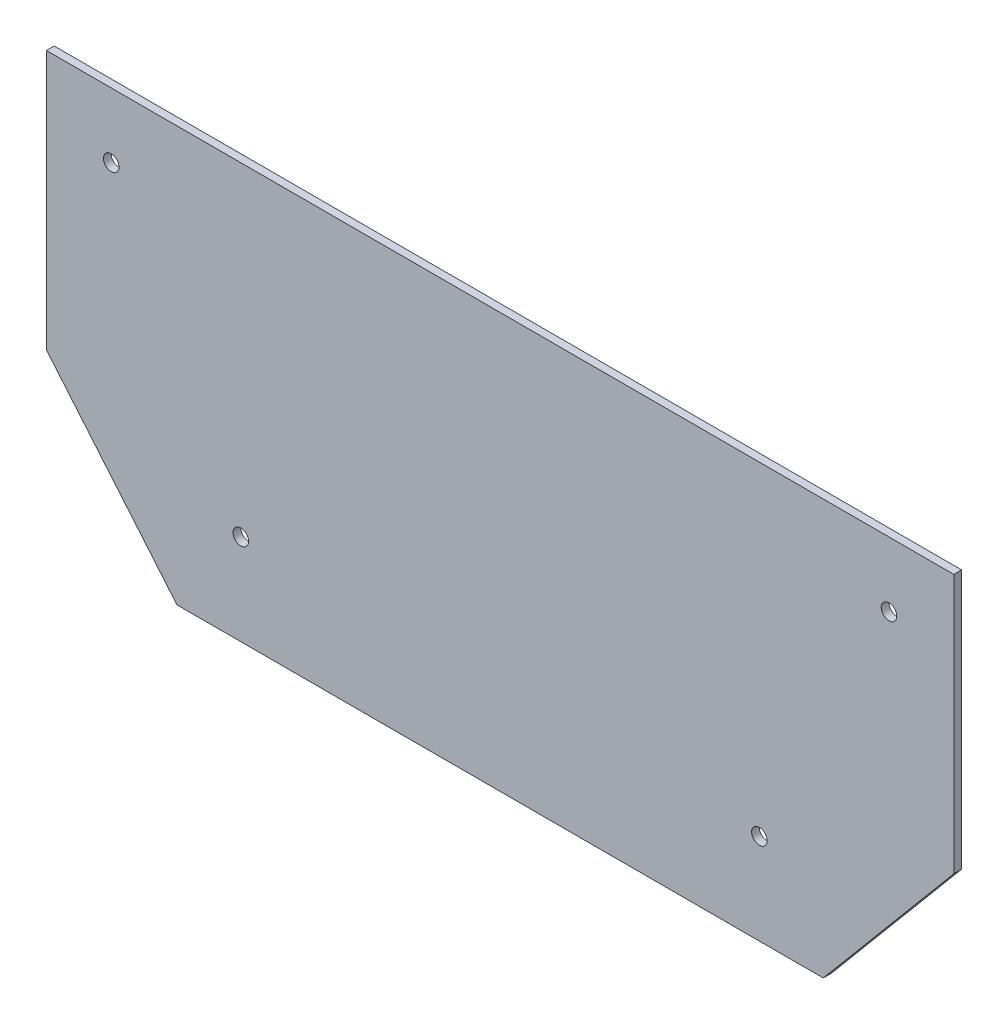
ISO-10303-21;
HEADER;
FILE_DESCRIPTION(('STEP AP214'),'2;1');
FILE_NAME('part.step','',(''),(''),'','','');
FILE_SCHEMA(('AUTOMOTIVE_DESIGN { 1 0 10303 214 1 1 1 1 }'));
ENDSEC;
DATA;
#1=APPLICATION_CONTEXT('core data for automotive mechanical design processes');
#2=APPLICATION_PROTOCOL_DEFINITION('international standard','automotive_design',2000,#1);
#3=PRODUCT_CONTEXT('',#1,'mechanical');
#4=PRODUCT('Part','Part','',(#3));
#5=PRODUCT_RELATED_PRODUCT_CATEGORY('part','',(#4));
#6=PRODUCT_DEFINITION_FORMATION('','',#4);
#7=PRODUCT_DEFINITION_CONTEXT('part definition',#1,'design');
#8=PRODUCT_DEFINITION('design','',#6,#7);
#9=PRODUCT_DEFINITION_SHAPE('','',#8);
#10=(LENGTH_UNIT() NAMED_UNIT(*) SI_UNIT(.MILLI.,.METRE.));
#11=(NAMED_UNIT(*) PLANE_ANGLE_UNIT() SI_UNIT($,.RADIAN.));
#12=(NAMED_UNIT(*) SI_UNIT($,.STERADIAN.) SOLID_ANGLE_UNIT());
#13=UNCERTAINTY_MEASURE_WITH_UNIT(LENGTH_MEASURE(1.E-05),#10,'distance_accuracy_value','');
#14=(GEOMETRIC_REPRESENTATION_CONTEXT(3) GLOBAL_UNCERTAINTY_ASSIGNED_CONTEXT((#13)) GLOBAL_UNIT_ASSIGNED_CONTEXT((#10,
#11,#12)) REPRESENTATION_CONTEXT('',''));
#15=CARTESIAN_POINT('',(0.,0.,0.));
#16=DIRECTION('',(0.,0.,1.));
#17=DIRECTION('',(1.,0.,0.));
#18=AXIS2_PLACEMENT_3D('',#15,#16,#17);
#19=CARTESIAN_POINT('',(0.,0.,1.5));
#20=DIRECTION('',(0.,0.,-1.));
#21=DIRECTION('',(-1.,0.,0.));
#22=AXIS2_PLACEMENT_3D('',#19,#20,#21);
#23=PLANE('',#22);
#24=DIRECTION('',(0.,-1.,0.));
#25=VECTOR('',#24,1.);
#26=CARTESIAN_POINT('',(-87.5,-10.,1.5));
#27=LINE('',#26,#25);
#28=CARTESIAN_POINT('',(-87.5,40.,1.5));
#29=VERTEX_POINT('',#28);
#30=CARTESIAN_POINT('',(-87.5,-10.,1.5));
#31=VERTEX_POINT('',#30);
#32=EDGE_CURVE('E129',#29,#31,#27,.T.);
#33=ORIENTED_EDGE('',*,*,#32,.T.);
#34=DIRECTION('',(0.642787609686538,-0.766044443118979,0.));
#35=VECTOR('',#34,1.);
#36=CARTESIAN_POINT('',(-62.3270110646817,-40.,1.5));
#37=LINE('',#36,#35);
#38=CARTESIAN_POINT('',(-62.3270110646817,-40.,1.5));
#39=VERTEX_POINT('',#38);
#40=EDGE_CURVE('E87',#31,#39,#37,.T.);
#41=ORIENTED_EDGE('',*,*,#40,.T.);
#42=DIRECTION('',(1.,0.,0.));
#43=VECTOR('',#42,1.);
#44=CARTESIAN_POINT('',(62.3270110646817,-40.,1.5));
#45=LINE('',#44,#43);
#46=CARTESIAN_POINT('',(62.3270110646817,-40.,1.5));
#47=VERTEX_POINT('',#46);
#48=EDGE_CURVE('E100',#39,#47,#45,.T.);
#49=ORIENTED_EDGE('',*,*,#48,.T.);
#50=DIRECTION('',(0.642787609686537,0.76604444311898,0.));
#51=VECTOR('',#50,1.);
#52=CARTESIAN_POINT('',(87.5,-9.99999999999995,1.5));
#53=LINE('',#52,#51);
#54=CARTESIAN_POINT('',(87.5,-9.99999999999995,1.5));
#55=VERTEX_POINT('',#54);
#56=EDGE_CURVE('E94',#47,#55,#53,.T.);
#57=ORIENTED_EDGE('',*,*,#56,.T.);
#58=DIRECTION('',(0.,1.,0.));
#59=VECTOR('',#58,1.);
#60=CARTESIAN_POINT('',(87.5,40.,1.5));
#61=LINE('',#60,#59);
#62=CARTESIAN_POINT('',(87.5,40.,1.5));
#63=VERTEX_POINT('',#62);
#64=EDGE_CURVE('E98',#55,#63,#61,.T.);
#65=ORIENTED_EDGE('',*,*,#64,.T.);
#66=DIRECTION('',(-1.,0.,0.));
#67=VECTOR('',#66,1.);
#68=CARTESIAN_POINT('',(-87.5,40.,1.5));
#69=LINE('',#68,#67);
#70=EDGE_CURVE('E50',#63,#29,#69,.T.);
#71=ORIENTED_EDGE('',*,*,#70,.T.);
#72=EDGE_LOOP('',(#33,#41,#49,#57,#65,#71));
#73=FACE_BOUND('',#72,.T.);
#74=CARTESIAN_POINT('',(-75.,27.5,1.5));
#75=DIRECTION('',(0.,0.,1.));
#76=DIRECTION('',(1.,0.,0.));
#77=AXIS2_PLACEMENT_3D('',#74,#75,#76);
#78=CIRCLE('',#77,1.5);
#79=CARTESIAN_POINT('',(-73.5,27.5,1.5));
#80=VERTEX_POINT('',#79);
#81=EDGE_CURVE('E122',#80,#80,#78,.T.);
#82=ORIENTED_EDGE('',*,*,#81,.F.);
#83=EDGE_LOOP('',(#82));
#84=FACE_BOUND('',#83,.T.);
#85=CARTESIAN_POINT('',(-50.,-22.5,1.5));
#86=DIRECTION('',(0.,0.,1.));
#87=DIRECTION('',(1.,0.,0.));
#88=AXIS2_PLACEMENT_3D('',#85,#86,#87);
#89=CIRCLE('',#88,1.5);
#90=CARTESIAN_POINT('',(-48.5,-22.5,1.5));
#91=VERTEX_POINT('',#90);
#92=EDGE_CURVE('E193',#91,#91,#89,.T.);
#93=ORIENTED_EDGE('',*,*,#92,.F.);
#94=EDGE_LOOP('',(#93));
#95=FACE_BOUND('',#94,.T.);
#96=CARTESIAN_POINT('',(50.,-22.5,1.5));
#97=DIRECTION('',(0.,0.,1.));
#98=DIRECTION('',(1.,0.,0.));
#99=AXIS2_PLACEMENT_3D('',#96,#97,#98);
#100=CIRCLE('',#99,1.5);
#101=CARTESIAN_POINT('',(51.5,-22.5,1.5));
#102=VERTEX_POINT('',#101);
#103=EDGE_CURVE('E187',#102,#102,#100,.T.);
#104=ORIENTED_EDGE('',*,*,#103,.F.);
#105=EDGE_LOOP('',(#104));
#106=FACE_BOUND('',#105,.T.);
#107=CARTESIAN_POINT('',(75.,27.5,1.5));
#108=DIRECTION('',(0.,0.,1.));
#109=DIRECTION('',(1.,0.,0.));
#110=AXIS2_PLACEMENT_3D('',#107,#108,#109);
#111=CIRCLE('',#110,1.5);
#112=CARTESIAN_POINT('',(76.5,27.5,1.5));
#113=VERTEX_POINT('',#112);
#114=EDGE_CURVE('E178',#113,#113,#111,.T.);
#115=ORIENTED_EDGE('',*,*,#114,.F.);
#116=EDGE_LOOP('',(#115));
#117=FACE_BOUND('',#116,.T.);
#118=ADVANCED_FACE('F33',(#73,#84,#95,#106,#117),#23,.F.);
#119=CARTESIAN_POINT('',(0.,0.,0.));
#120=DIRECTION('',(0.,0.,-1.));
#121=DIRECTION('',(-1.,0.,0.));
#122=AXIS2_PLACEMENT_3D('',#119,#120,#121);
#123=PLANE('',#122);
#124=CARTESIAN_POINT('',(50.,-22.5,0.));
#125=DIRECTION('',(0.,0.,1.));
#126=DIRECTION('',(1.,0.,0.));
#127=AXIS2_PLACEMENT_3D('',#124,#125,#126);
#128=CIRCLE('',#127,1.5);
#129=CARTESIAN_POINT('',(51.5,-22.5,0.));
#130=VERTEX_POINT('',#129);
#131=EDGE_CURVE('E184',#130,#130,#128,.T.);
#132=ORIENTED_EDGE('',*,*,#131,.T.);
#133=EDGE_LOOP('',(#132));
#134=FACE_BOUND('',#133,.T.);
#135=CARTESIAN_POINT('',(-75.,27.5,0.));
#136=DIRECTION('',(0.,0.,1.));
#137=DIRECTION('',(1.,0.,0.));
#138=AXIS2_PLACEMENT_3D('',#135,#136,#137);
#139=CIRCLE('',#138,1.5);
#140=CARTESIAN_POINT('',(-73.5,27.5,0.));
#141=VERTEX_POINT('',#140);
#142=EDGE_CURVE('E196',#141,#141,#139,.T.);
#143=ORIENTED_EDGE('',*,*,#142,.T.);
#144=EDGE_LOOP('',(#143));
#145=FACE_BOUND('',#144,.T.);
#146=DIRECTION('',(0.,-1.,0.));
#147=VECTOR('',#146,1.);
#148=CARTESIAN_POINT('',(-87.5,-10.,0.));
#149=LINE('',#148,#147);
#150=CARTESIAN_POINT('',(-87.5,40.,0.));
#151=VERTEX_POINT('',#150);
#152=CARTESIAN_POINT('',(-87.5,-10.,0.));
#153=VERTEX_POINT('',#152);
#154=EDGE_CURVE('E118',#151,#153,#149,.T.);
#155=ORIENTED_EDGE('',*,*,#154,.F.);
#156=DIRECTION('',(-1.,0.,0.));
#157=VECTOR('',#156,1.);
#158=CARTESIAN_POINT('',(-87.5,40.,0.));
#159=LINE('',#158,#157);
#160=CARTESIAN_POINT('',(87.5,40.,0.));
#161=VERTEX_POINT('',#160);
#162=EDGE_CURVE('E79',#161,#151,#159,.T.);
#163=ORIENTED_EDGE('',*,*,#162,.F.);
#164=DIRECTION('',(0.,1.,0.));
#165=VECTOR('',#164,1.);
#166=CARTESIAN_POINT('',(87.5,40.,0.));
#167=LINE('',#166,#165);
#168=CARTESIAN_POINT('',(87.5,-9.99999999999995,0.));
#169=VERTEX_POINT('',#168);
#170=EDGE_CURVE('E73',#169,#161,#167,.T.);
#171=ORIENTED_EDGE('',*,*,#170,.F.);
#172=DIRECTION('',(0.642787609686537,0.76604444311898,0.));
#173=VECTOR('',#172,1.);
#174=CARTESIAN_POINT('',(87.5,-9.99999999999995,0.));
#175=LINE('',#174,#173);
#176=CARTESIAN_POINT('',(62.3270110646817,-40.,0.));
#177=VERTEX_POINT('',#176);
#178=EDGE_CURVE('E108',#177,#169,#175,.T.);
#179=ORIENTED_EDGE('',*,*,#178,.F.);
#180=DIRECTION('',(1.,0.,0.));
#181=VECTOR('',#180,1.);
#182=CARTESIAN_POINT('',(62.3270110646817,-40.,0.));
#183=LINE('',#182,#181);
#184=CARTESIAN_POINT('',(-62.3270110646817,-40.,0.));
#185=VERTEX_POINT('',#184);
#186=EDGE_CURVE('E124',#185,#177,#183,.T.);
#187=ORIENTED_EDGE('',*,*,#186,.F.);
#188=DIRECTION('',(0.642787609686538,-0.766044443118979,0.));
#189=VECTOR('',#188,1.);
#190=CARTESIAN_POINT('',(-62.3270110646817,-40.,0.));
#191=LINE('',#190,#189);
#192=EDGE_CURVE('E121',#153,#185,#191,.T.);
#193=ORIENTED_EDGE('',*,*,#192,.F.);
#194=EDGE_LOOP('',(#155,#163,#171,#179,#187,#193));
#195=FACE_BOUND('',#194,.T.);
#196=CARTESIAN_POINT('',(-50.,-22.5,0.));
#197=DIRECTION('',(0.,0.,1.));
#198=DIRECTION('',(1.,0.,0.));
#199=AXIS2_PLACEMENT_3D('',#196,#197,#198);
#200=CIRCLE('',#199,1.5);
#201=CARTESIAN_POINT('',(-48.5,-22.5,0.));
#202=VERTEX_POINT('',#201);
#203=EDGE_CURVE('E190',#202,#202,#200,.T.);
#204=ORIENTED_EDGE('',*,*,#203,.T.);
#205=EDGE_LOOP('',(#204));
#206=FACE_BOUND('',#205,.T.);
#207=CARTESIAN_POINT('',(75.,27.5,0.));
#208=DIRECTION('',(0.,0.,1.));
#209=DIRECTION('',(1.,0.,0.));
#210=AXIS2_PLACEMENT_3D('',#207,#208,#209);
#211=CIRCLE('',#210,1.5);
#212=CARTESIAN_POINT('',(76.5,27.5,0.));
#213=VERTEX_POINT('',#212);
#214=EDGE_CURVE('E181',#213,#213,#211,.T.);
#215=ORIENTED_EDGE('',*,*,#214,.T.);
#216=EDGE_LOOP('',(#215));
#217=FACE_BOUND('',#216,.T.);
#218=ADVANCED_FACE('F138',(#134,#145,#195,#206,#217),#123,.T.);
#219=CARTESIAN_POINT('',(-87.5,-10.,1.5));
#220=DIRECTION('',(1.,0.,0.));
#221=DIRECTION('',(0.,0.,-1.));
#222=AXIS2_PLACEMENT_3D('',#219,#220,#221);
#223=PLANE('',#222);
#224=ORIENTED_EDGE('',*,*,#154,.T.);
#225=DIRECTION('',(0.,0.,-1.));
#226=VECTOR('',#225,1.);
#227=CARTESIAN_POINT('',(-87.5,-10.,1.5));
#228=LINE('',#227,#226);
#229=EDGE_CURVE('E11',#31,#153,#228,.T.);
#230=ORIENTED_EDGE('',*,*,#229,.F.);
#231=ORIENTED_EDGE('',*,*,#32,.F.);
#232=DIRECTION('',(0.,0.,-1.));
#233=VECTOR('',#232,1.);
#234=CARTESIAN_POINT('',(-87.5,40.,1.5));
#235=LINE('',#234,#233);
#236=EDGE_CURVE('E114',#29,#151,#235,.T.);
#237=ORIENTED_EDGE('',*,*,#236,.T.);
#238=EDGE_LOOP('',(#224,#230,#231,#237));
#239=FACE_BOUND('',#238,.T.);
#240=ADVANCED_FACE('F35',(#239),#223,.F.);
#241=CARTESIAN_POINT('',(-62.3270110646817,-40.,1.5));
#242=DIRECTION('',(0.766044443118979,0.642787609686538,0.));
#243=DIRECTION('',(-0.642787609686538,0.766044443118979,0.));
#244=AXIS2_PLACEMENT_3D('',#241,#242,#243);
#245=PLANE('',#244);
#246=ORIENTED_EDGE('',*,*,#192,.T.);
#247=DIRECTION('',(0.,0.,-1.));
#248=VECTOR('',#247,1.);
#249=CARTESIAN_POINT('',(-62.3270110646817,-40.,1.5));
#250=LINE('',#249,#248);
#251=EDGE_CURVE('E42',#39,#185,#250,.T.);
#252=ORIENTED_EDGE('',*,*,#251,.F.);
#253=ORIENTED_EDGE('',*,*,#40,.F.);
#254=ORIENTED_EDGE('',*,*,#229,.T.);
#255=EDGE_LOOP('',(#246,#252,#253,#254));
#256=FACE_BOUND('',#255,.T.);
#257=ADVANCED_FACE('F256',(#256),#245,.F.);
#258=CARTESIAN_POINT('',(62.3270110646817,-40.,1.5));
#259=DIRECTION('',(0.,1.,0.));
#260=DIRECTION('',(-1.,0.,0.));
#261=AXIS2_PLACEMENT_3D('',#258,#259,#260);
#262=PLANE('',#261);
#263=ORIENTED_EDGE('',*,*,#186,.T.);
#264=DIRECTION('',(0.,0.,-1.));
#265=VECTOR('',#264,1.);
#266=CARTESIAN_POINT('',(62.3270110646817,-40.,1.5));
#267=LINE('',#266,#265);
#268=EDGE_CURVE('E109',#47,#177,#267,.T.);
#269=ORIENTED_EDGE('',*,*,#268,.F.);
#270=ORIENTED_EDGE('',*,*,#48,.F.);
#271=ORIENTED_EDGE('',*,*,#251,.T.);
#272=EDGE_LOOP('',(#263,#269,#270,#271));
#273=FACE_BOUND('',#272,.T.);
#274=ADVANCED_FACE('F135',(#273),#262,.F.);
#275=CARTESIAN_POINT('',(87.5,-9.99999999999995,1.5));
#276=DIRECTION('',(-0.76604444311898,0.642787609686537,0.));
#277=DIRECTION('',(-0.642787609686537,-0.76604444311898,0.));
#278=AXIS2_PLACEMENT_3D('',#275,#276,#277);
#279=PLANE('',#278);
#280=ORIENTED_EDGE('',*,*,#178,.T.);
#281=DIRECTION('',(0.,0.,-1.));
#282=VECTOR('',#281,1.);
#283=CARTESIAN_POINT('',(87.5,-9.99999999999995,1.5));
#284=LINE('',#283,#282);
#285=EDGE_CURVE('E105',#55,#169,#284,.T.);
#286=ORIENTED_EDGE('',*,*,#285,.F.);
#287=ORIENTED_EDGE('',*,*,#56,.F.);
#288=ORIENTED_EDGE('',*,*,#268,.T.);
#289=EDGE_LOOP('',(#280,#286,#287,#288));
#290=FACE_BOUND('',#289,.T.);
#291=ADVANCED_FACE('F106',(#290),#279,.F.);
#292=CARTESIAN_POINT('',(87.5,40.,1.5));
#293=DIRECTION('',(-1.,0.,0.));
#294=DIRECTION('',(0.,0.,1.));
#295=AXIS2_PLACEMENT_3D('',#292,#293,#294);
#296=PLANE('',#295);
#297=ORIENTED_EDGE('',*,*,#170,.T.);
#298=DIRECTION('',(0.,0.,-1.));
#299=VECTOR('',#298,1.);
#300=CARTESIAN_POINT('',(87.5,40.,1.5));
#301=LINE('',#300,#299);
#302=EDGE_CURVE('E110',#63,#161,#301,.T.);
#303=ORIENTED_EDGE('',*,*,#302,.F.);
#304=ORIENTED_EDGE('',*,*,#64,.F.);
#305=ORIENTED_EDGE('',*,*,#285,.T.);
#306=EDGE_LOOP('',(#297,#303,#304,#305));
#307=FACE_BOUND('',#306,.T.);
#308=ADVANCED_FACE('F112',(#307),#296,.F.);
#309=CARTESIAN_POINT('',(-87.5,40.,1.5));
#310=DIRECTION('',(0.,-1.,0.));
#311=DIRECTION('',(0.,0.,-1.));
#312=AXIS2_PLACEMENT_3D('',#309,#310,#311);
#313=PLANE('',#312);
#314=ORIENTED_EDGE('',*,*,#162,.T.);
#315=ORIENTED_EDGE('',*,*,#236,.F.);
#316=ORIENTED_EDGE('',*,*,#70,.F.);
#317=ORIENTED_EDGE('',*,*,#302,.T.);
#318=EDGE_LOOP('',(#314,#315,#316,#317));
#319=FACE_BOUND('',#318,.T.);
#320=ADVANCED_FACE('F143',(#319),#313,.F.);
#321=CARTESIAN_POINT('',(-75.,27.5,1.5));
#322=DIRECTION('',(0.,0.,-1.));
#323=DIRECTION('',(-1.,0.,0.));
#324=AXIS2_PLACEMENT_3D('',#321,#322,#323);
#325=CYLINDRICAL_SURFACE('',#324,1.5);
#326=ORIENTED_EDGE('',*,*,#81,.T.);
#327=EDGE_LOOP('',(#326));
#328=FACE_BOUND('',#327,.T.);
#329=ORIENTED_EDGE('',*,*,#142,.F.);
#330=EDGE_LOOP('',(#329));
#331=FACE_BOUND('',#330,.T.);
#332=ADVANCED_FACE('F145',(#328,#331),#325,.F.);
#333=CARTESIAN_POINT('',(-50.,-22.5,1.5));
#334=DIRECTION('',(0.,0.,-1.));
#335=DIRECTION('',(-1.,0.,0.));
#336=AXIS2_PLACEMENT_3D('',#333,#334,#335);
#337=CYLINDRICAL_SURFACE('',#336,1.5);
#338=ORIENTED_EDGE('',*,*,#92,.T.);
#339=EDGE_LOOP('',(#338));
#340=FACE_BOUND('',#339,.T.);
#341=ORIENTED_EDGE('',*,*,#203,.F.);
#342=EDGE_LOOP('',(#341));
#343=FACE_BOUND('',#342,.T.);
#344=ADVANCED_FACE('F151',(#340,#343),#337,.F.);
#345=CARTESIAN_POINT('',(50.,-22.5,1.5));
#346=DIRECTION('',(0.,0.,-1.));
#347=DIRECTION('',(-1.,0.,0.));
#348=AXIS2_PLACEMENT_3D('',#345,#346,#347);
#349=CYLINDRICAL_SURFACE('',#348,1.5);
#350=ORIENTED_EDGE('',*,*,#103,.T.);
#351=EDGE_LOOP('',(#350));
#352=FACE_BOUND('',#351,.T.);
#353=ORIENTED_EDGE('',*,*,#131,.F.);
#354=EDGE_LOOP('',(#353));
#355=FACE_BOUND('',#354,.T.);
#356=ADVANCED_FACE('F165',(#352,#355),#349,.F.);
#357=CARTESIAN_POINT('',(75.,27.5,1.5));
#358=DIRECTION('',(0.,0.,-1.));
#359=DIRECTION('',(-1.,0.,0.));
#360=AXIS2_PLACEMENT_3D('',#357,#358,#359);
#361=CYLINDRICAL_SURFACE('',#360,1.5);
#362=ORIENTED_EDGE('',*,*,#114,.T.);
#363=EDGE_LOOP('',(#362));
#364=FACE_BOUND('',#363,.T.);
#365=ORIENTED_EDGE('',*,*,#214,.F.);
#366=EDGE_LOOP('',(#365));
#367=FACE_BOUND('',#366,.T.);
#368=ADVANCED_FACE('F169',(#364,#367),#361,.F.);
#369=CLOSED_SHELL('',(#118,#218,#240,#257,#274,#291,#308,#320,#332,#344,#356,#368));
#370=MANIFOLD_SOLID_BREP('B2',#369);
#371=ADVANCED_BREP_SHAPE_REPRESENTATION('',(#18,#370),#14);
#372=SHAPE_DEFINITION_REPRESENTATION(#9,#371);
ENDSEC;
END-ISO-10303-21;
